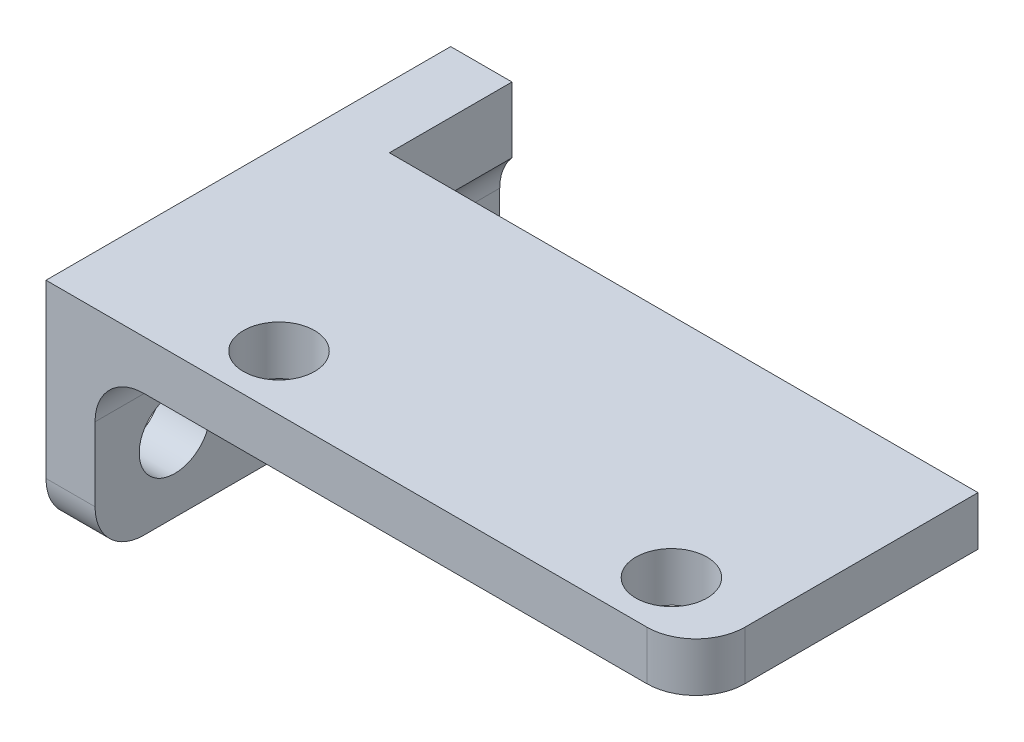
ISO-10303-21;
HEADER;
FILE_DESCRIPTION(('STEP AP214'),'2;1');
FILE_NAME('part.step','',(''),(''),'','','');
FILE_SCHEMA(('AUTOMOTIVE_DESIGN { 1 0 10303 214 1 1 1 1 }'));
ENDSEC;
DATA;
#1=APPLICATION_CONTEXT('core data for automotive mechanical design processes');
#2=APPLICATION_PROTOCOL_DEFINITION('international standard','automotive_design',2000,#1);
#3=PRODUCT_CONTEXT('',#1,'mechanical');
#4=PRODUCT('Part','Part','',(#3));
#5=PRODUCT_RELATED_PRODUCT_CATEGORY('part','',(#4));
#6=PRODUCT_DEFINITION_FORMATION('','',#4);
#7=PRODUCT_DEFINITION_CONTEXT('part definition',#1,'design');
#8=PRODUCT_DEFINITION('design','',#6,#7);
#9=PRODUCT_DEFINITION_SHAPE('','',#8);
#10=(LENGTH_UNIT() NAMED_UNIT(*) SI_UNIT(.MILLI.,.METRE.));
#11=(NAMED_UNIT(*) PLANE_ANGLE_UNIT() SI_UNIT($,.RADIAN.));
#12=(NAMED_UNIT(*) SI_UNIT($,.STERADIAN.) SOLID_ANGLE_UNIT());
#13=UNCERTAINTY_MEASURE_WITH_UNIT(LENGTH_MEASURE(1.E-05),#10,'distance_accuracy_value','');
#14=(GEOMETRIC_REPRESENTATION_CONTEXT(3) GLOBAL_UNCERTAINTY_ASSIGNED_CONTEXT((#13)) GLOBAL_UNIT_ASSIGNED_CONTEXT((#10,
#11,#12)) REPRESENTATION_CONTEXT('',''));
#15=CARTESIAN_POINT('',(0.,0.,0.));
#16=DIRECTION('',(0.,0.,1.));
#17=DIRECTION('',(1.,0.,0.));
#18=AXIS2_PLACEMENT_3D('',#15,#16,#17);
#19=CARTESIAN_POINT('',(0.,2.,0.));
#20=DIRECTION('',(0.,-1.,0.));
#21=DIRECTION('',(0.,0.,-1.));
#22=AXIS2_PLACEMENT_3D('',#19,#20,#21);
#23=PLANE('',#22);
#24=DIRECTION('',(1.,0.,0.));
#25=VECTOR('',#24,1.);
#26=CARTESIAN_POINT('',(-12.75,2.,-3.25000000000001));
#27=LINE('',#26,#25);
#28=CARTESIAN_POINT('',(-12.75,2.,-3.25000000000001));
#29=VERTEX_POINT('',#28);
#30=CARTESIAN_POINT('',(11.25,2.,-3.25000000000001));
#31=VERTEX_POINT('',#30);
#32=EDGE_CURVE('E132',#29,#31,#27,.T.);
#33=ORIENTED_EDGE('',*,*,#32,.F.);
#34=DIRECTION('',(0.,0.,1.));
#35=VECTOR('',#34,1.);
#36=CARTESIAN_POINT('',(-12.75,2.,-8.25000000000001));
#37=LINE('',#36,#35);
#38=CARTESIAN_POINT('',(-12.75,2.,-8.25000000000001));
#39=VERTEX_POINT('',#38);
#40=EDGE_CURVE('E138',#39,#29,#37,.T.);
#41=ORIENTED_EDGE('',*,*,#40,.F.);
#42=DIRECTION('',(-1.,0.,0.));
#43=VECTOR('',#42,1.);
#44=CARTESIAN_POINT('',(-11.25,2.,-8.25000000000002));
#45=LINE('',#44,#43);
#46=CARTESIAN_POINT('',(-15.25,2.,-8.25000000000001));
#47=VERTEX_POINT('',#46);
#48=EDGE_CURVE('E196',#39,#47,#45,.T.);
#49=ORIENTED_EDGE('',*,*,#48,.T.);
#50=DIRECTION('',(0.,0.,-1.));
#51=VECTOR('',#50,1.);
#52=CARTESIAN_POINT('',(-15.25,2.,-8.25000000000001));
#53=LINE('',#52,#51);
#54=CARTESIAN_POINT('',(-15.25,2.,8.24999999999999));
#55=VERTEX_POINT('',#54);
#56=EDGE_CURVE('E173',#55,#47,#53,.T.);
#57=ORIENTED_EDGE('',*,*,#56,.F.);
#58=DIRECTION('',(1.,0.,0.));
#59=VECTOR('',#58,1.);
#60=CARTESIAN_POINT('',(-13.25,2.,8.24999999999998));
#61=LINE('',#60,#59);
#62=CARTESIAN_POINT('',(9.24999999999998,2.,8.25));
#63=VERTEX_POINT('',#62);
#64=EDGE_CURVE('E199',#55,#63,#61,.T.);
#65=ORIENTED_EDGE('',*,*,#64,.T.);
#66=CARTESIAN_POINT('',(9.24999999999999,2.,6.24999999999999));
#67=DIRECTION('',(0.,-1.,0.));
#68=DIRECTION('',(0.,0.,-1.));
#69=AXIS2_PLACEMENT_3D('',#66,#67,#68);
#70=CIRCLE('',#69,2.);
#71=CARTESIAN_POINT('',(11.25,2.,6.25));
#72=VERTEX_POINT('',#71);
#73=EDGE_CURVE('E62',#63,#72,#70,.F.);
#74=ORIENTED_EDGE('',*,*,#73,.T.);
#75=DIRECTION('',(0.,0.,-1.));
#76=VECTOR('',#75,1.);
#77=CARTESIAN_POINT('',(11.25,2.,-8.25));
#78=LINE('',#77,#76);
#79=EDGE_CURVE('E145',#72,#31,#78,.T.);
#80=ORIENTED_EDGE('',*,*,#79,.T.);
#81=EDGE_LOOP('',(#33,#41,#49,#57,#65,#74,#80));
#82=FACE_BOUND('',#81,.T.);
#83=CARTESIAN_POINT('',(-8.,2.,5.99999999999998));
#84=DIRECTION('',(0.,1.,0.));
#85=DIRECTION('',(0.,0.,1.));
#86=AXIS2_PLACEMENT_3D('',#83,#84,#85);
#87=CIRCLE('',#86,1.45);
#88=CARTESIAN_POINT('',(-8.,2.,7.44999999999998));
#89=VERTEX_POINT('',#88);
#90=EDGE_CURVE('E189',#89,#89,#87,.T.);
#91=ORIENTED_EDGE('',*,*,#90,.F.);
#92=EDGE_LOOP('',(#91));
#93=FACE_BOUND('',#92,.T.);
#94=CARTESIAN_POINT('',(8.,2.,5.99999999999998));
#95=DIRECTION('',(0.,1.,0.));
#96=DIRECTION('',(0.,0.,-1.));
#97=AXIS2_PLACEMENT_3D('',#94,#95,#96);
#98=CIRCLE('',#97,1.45);
#99=CARTESIAN_POINT('',(8.,2.,4.54999999999998));
#100=VERTEX_POINT('',#99);
#101=EDGE_CURVE('E183',#100,#100,#98,.T.);
#102=ORIENTED_EDGE('',*,*,#101,.F.);
#103=EDGE_LOOP('',(#102));
#104=FACE_BOUND('',#103,.T.);
#105=ADVANCED_FACE('F39',(#82,#93,#104),#23,.F.);
#106=CARTESIAN_POINT('',(0.,0.,0.));
#107=DIRECTION('',(0.,-1.,0.));
#108=DIRECTION('',(0.,0.,-1.));
#109=AXIS2_PLACEMENT_3D('',#106,#107,#108);
#110=PLANE('',#109);
#111=DIRECTION('',(-1.,0.,0.));
#112=VECTOR('',#111,1.);
#113=CARTESIAN_POINT('',(0.,0.,-3.25000000000001));
#114=LINE('',#113,#112);
#115=CARTESIAN_POINT('',(11.25,0.,-3.25000000000001));
#116=VERTEX_POINT('',#115);
#117=CARTESIAN_POINT('',(-11.25,0.,-3.25000000000001));
#118=VERTEX_POINT('',#117);
#119=EDGE_CURVE('E54',#116,#118,#114,.T.);
#120=ORIENTED_EDGE('',*,*,#119,.F.);
#121=DIRECTION('',(0.,0.,-1.));
#122=VECTOR('',#121,1.);
#123=CARTESIAN_POINT('',(11.25,0.,-8.25));
#124=LINE('',#123,#122);
#125=CARTESIAN_POINT('',(11.25,0.,6.25));
#126=VERTEX_POINT('',#125);
#127=EDGE_CURVE('E192',#126,#116,#124,.T.);
#128=ORIENTED_EDGE('',*,*,#127,.F.);
#129=CARTESIAN_POINT('',(9.24999999999999,0.,6.24999999999999));
#130=DIRECTION('',(0.,-1.,0.));
#131=DIRECTION('',(0.,0.,-1.));
#132=AXIS2_PLACEMENT_3D('',#129,#130,#131);
#133=CIRCLE('',#132,2.);
#134=CARTESIAN_POINT('',(9.24999999999998,0.,8.24999999999999));
#135=VERTEX_POINT('',#134);
#136=EDGE_CURVE('E235',#126,#135,#133,.T.);
#137=ORIENTED_EDGE('',*,*,#136,.T.);
#138=DIRECTION('',(1.,0.,0.));
#139=VECTOR('',#138,1.);
#140=CARTESIAN_POINT('',(11.25,0.,8.24999999999999));
#141=LINE('',#140,#139);
#142=CARTESIAN_POINT('',(-11.25,0.,8.24999999999998));
#143=VERTEX_POINT('',#142);
#144=EDGE_CURVE('E197',#143,#135,#141,.T.);
#145=ORIENTED_EDGE('',*,*,#144,.F.);
#146=DIRECTION('',(0.,0.,1.));
#147=VECTOR('',#146,1.);
#148=CARTESIAN_POINT('',(-11.25,0.,0.));
#149=LINE('',#148,#147);
#150=EDGE_CURVE('E208',#143,#118,#149,.F.);
#151=ORIENTED_EDGE('',*,*,#150,.T.);
#152=EDGE_LOOP('',(#120,#128,#137,#145,#151));
#153=FACE_BOUND('',#152,.T.);
#154=CARTESIAN_POINT('',(-8.,0.,5.99999999999998));
#155=DIRECTION('',(0.,1.,0.));
#156=DIRECTION('',(0.,0.,1.));
#157=AXIS2_PLACEMENT_3D('',#154,#155,#156);
#158=CIRCLE('',#157,1.45);
#159=CARTESIAN_POINT('',(-8.,0.,7.44999999999998));
#160=VERTEX_POINT('',#159);
#161=EDGE_CURVE('E186',#160,#160,#158,.T.);
#162=ORIENTED_EDGE('',*,*,#161,.T.);
#163=EDGE_LOOP('',(#162));
#164=FACE_BOUND('',#163,.T.);
#165=CARTESIAN_POINT('',(8.,0.,5.99999999999998));
#166=DIRECTION('',(0.,1.,0.));
#167=DIRECTION('',(0.,0.,-1.));
#168=AXIS2_PLACEMENT_3D('',#165,#166,#167);
#169=CIRCLE('',#168,1.45);
#170=CARTESIAN_POINT('',(8.,0.,4.54999999999998));
#171=VERTEX_POINT('',#170);
#172=EDGE_CURVE('E176',#171,#171,#169,.T.);
#173=ORIENTED_EDGE('',*,*,#172,.T.);
#174=EDGE_LOOP('',(#173));
#175=FACE_BOUND('',#174,.T.);
#176=ADVANCED_FACE('F247',(#153,#164,#175),#110,.T.);
#177=CARTESIAN_POINT('',(11.25,2.,-8.25));
#178=DIRECTION('',(-1.,0.,0.));
#179=DIRECTION('',(0.,0.,1.));
#180=AXIS2_PLACEMENT_3D('',#177,#178,#179);
#181=PLANE('',#180);
#182=ORIENTED_EDGE('',*,*,#127,.T.);
#183=DIRECTION('',(0.,1.,0.));
#184=VECTOR('',#183,1.);
#185=CARTESIAN_POINT('',(11.25,-7.,-3.25000000000001));
#186=LINE('',#185,#184);
#187=EDGE_CURVE('E135',#116,#31,#186,.T.);
#188=ORIENTED_EDGE('',*,*,#187,.T.);
#189=ORIENTED_EDGE('',*,*,#79,.F.);
#190=DIRECTION('',(0.,-1.,0.));
#191=VECTOR('',#190,1.);
#192=CARTESIAN_POINT('',(11.25,2.,6.25));
#193=LINE('',#192,#191);
#194=EDGE_CURVE('E237',#72,#126,#193,.T.);
#195=ORIENTED_EDGE('',*,*,#194,.T.);
#196=EDGE_LOOP('',(#182,#188,#189,#195));
#197=FACE_BOUND('',#196,.T.);
#198=ADVANCED_FACE('F258',(#197),#181,.F.);
#199=CARTESIAN_POINT('',(-11.25,2.,-8.25000000000002));
#200=DIRECTION('',(0.,0.,1.));
#201=DIRECTION('',(1.,0.,0.));
#202=AXIS2_PLACEMENT_3D('',#199,#200,#201);
#203=PLANE('',#202);
#204=ORIENTED_EDGE('',*,*,#48,.F.);
#205=DIRECTION('',(0.,1.,0.));
#206=VECTOR('',#205,1.);
#207=CARTESIAN_POINT('',(-12.75,-7.,-8.25000000000001));
#208=LINE('',#207,#206);
#209=CARTESIAN_POINT('',(-12.75,-0.6771243444677,-8.25000000000001));
#210=VERTEX_POINT('',#209);
#211=EDGE_CURVE('E141',#210,#39,#208,.T.);
#212=ORIENTED_EDGE('',*,*,#211,.F.);
#213=CARTESIAN_POINT('',(-11.25,-2.,-8.25000000000002));
#214=DIRECTION('',(0.,0.,1.));
#215=DIRECTION('',(1.,0.,0.));
#216=AXIS2_PLACEMENT_3D('',#213,#214,#215);
#217=CIRCLE('',#216,2.);
#218=CARTESIAN_POINT('',(-13.25,-2.,-8.25000000000001));
#219=VERTEX_POINT('',#218);
#220=EDGE_CURVE('E213',#210,#219,#217,.T.);
#221=ORIENTED_EDGE('',*,*,#220,.T.);
#222=DIRECTION('',(0.,-1.,0.));
#223=VECTOR('',#222,1.);
#224=CARTESIAN_POINT('',(-13.25,2.,-8.25000000000001));
#225=LINE('',#224,#223);
#226=CARTESIAN_POINT('',(-13.25,-5.,-8.25000000000001));
#227=VERTEX_POINT('',#226);
#228=EDGE_CURVE('E161',#219,#227,#225,.T.);
#229=ORIENTED_EDGE('',*,*,#228,.T.);
#230=DIRECTION('',(1.,0.,0.));
#231=VECTOR('',#230,1.);
#232=CARTESIAN_POINT('',(-11.25,-5.,-8.25000000000002));
#233=LINE('',#232,#231);
#234=CARTESIAN_POINT('',(-15.25,-5.,-8.25000000000001));
#235=VERTEX_POINT('',#234);
#236=EDGE_CURVE('E233',#227,#235,#233,.F.);
#237=ORIENTED_EDGE('',*,*,#236,.T.);
#238=DIRECTION('',(0.,-1.,0.));
#239=VECTOR('',#238,1.);
#240=CARTESIAN_POINT('',(-15.25,2.,-8.25000000000001));
#241=LINE('',#240,#239);
#242=EDGE_CURVE('E164',#47,#235,#241,.T.);
#243=ORIENTED_EDGE('',*,*,#242,.F.);
#244=EDGE_LOOP('',(#204,#212,#221,#229,#237,#243));
#245=FACE_BOUND('',#244,.T.);
#246=ADVANCED_FACE('F260',(#245),#203,.F.);
#247=CARTESIAN_POINT('',(11.25,2.,8.24999999999999));
#248=DIRECTION('',(0.,0.,-1.));
#249=DIRECTION('',(-1.,0.,0.));
#250=AXIS2_PLACEMENT_3D('',#247,#248,#249);
#251=PLANE('',#250);
#252=DIRECTION('',(0.,1.,0.));
#253=VECTOR('',#252,1.);
#254=CARTESIAN_POINT('',(-15.25,2.,8.24999999999999));
#255=LINE('',#254,#253);
#256=CARTESIAN_POINT('',(-15.25,-5.,8.24999999999999));
#257=VERTEX_POINT('',#256);
#258=EDGE_CURVE('E171',#257,#55,#255,.T.);
#259=ORIENTED_EDGE('',*,*,#258,.F.);
#260=DIRECTION('',(1.,0.,0.));
#261=VECTOR('',#260,1.);
#262=CARTESIAN_POINT('',(11.25,-5.,8.24999999999999));
#263=LINE('',#262,#261);
#264=CARTESIAN_POINT('',(-13.25,-5.,8.24999999999999));
#265=VERTEX_POINT('',#264);
#266=EDGE_CURVE('E217',#257,#265,#263,.T.);
#267=ORIENTED_EDGE('',*,*,#266,.T.);
#268=DIRECTION('',(0.,1.,0.));
#269=VECTOR('',#268,1.);
#270=CARTESIAN_POINT('',(-13.25,2.,8.24999999999999));
#271=LINE('',#270,#269);
#272=CARTESIAN_POINT('',(-13.25,-2.,8.24999999999999));
#273=VERTEX_POINT('',#272);
#274=EDGE_CURVE('E168',#265,#273,#271,.T.);
#275=ORIENTED_EDGE('',*,*,#274,.T.);
#276=CARTESIAN_POINT('',(-11.25,-2.,8.24999999999998));
#277=DIRECTION('',(0.,0.,-1.));
#278=DIRECTION('',(-1.,0.,0.));
#279=AXIS2_PLACEMENT_3D('',#276,#277,#278);
#280=CIRCLE('',#279,2.);
#281=EDGE_CURVE('E211',#273,#143,#280,.T.);
#282=ORIENTED_EDGE('',*,*,#281,.T.);
#283=ORIENTED_EDGE('',*,*,#144,.T.);
#284=DIRECTION('',(0.,-1.,0.));
#285=VECTOR('',#284,1.);
#286=CARTESIAN_POINT('',(9.24999999999998,2.,8.24999999999999));
#287=LINE('',#286,#285);
#288=EDGE_CURVE('E215',#135,#63,#287,.F.);
#289=ORIENTED_EDGE('',*,*,#288,.T.);
#290=ORIENTED_EDGE('',*,*,#64,.F.);
#291=EDGE_LOOP('',(#259,#267,#275,#282,#283,#289,#290));
#292=FACE_BOUND('',#291,.T.);
#293=ADVANCED_FACE('F253',(#292),#251,.F.);
#294=CARTESIAN_POINT('',(-8.,2.,5.99999999999998));
#295=DIRECTION('',(0.,-1.,0.));
#296=DIRECTION('',(0.,0.,-1.));
#297=AXIS2_PLACEMENT_3D('',#294,#295,#296);
#298=CYLINDRICAL_SURFACE('',#297,1.45);
#299=ORIENTED_EDGE('',*,*,#90,.T.);
#300=EDGE_LOOP('',(#299));
#301=FACE_BOUND('',#300,.T.);
#302=ORIENTED_EDGE('',*,*,#161,.F.);
#303=EDGE_LOOP('',(#302));
#304=FACE_BOUND('',#303,.T.);
#305=ADVANCED_FACE('F276',(#301,#304),#298,.F.);
#306=CARTESIAN_POINT('',(8.,2.,5.99999999999998));
#307=DIRECTION('',(0.,-1.,0.));
#308=DIRECTION('',(0.,0.,-1.));
#309=AXIS2_PLACEMENT_3D('',#306,#307,#308);
#310=CYLINDRICAL_SURFACE('',#309,1.45);
#311=ORIENTED_EDGE('',*,*,#101,.T.);
#312=EDGE_LOOP('',(#311));
#313=FACE_BOUND('',#312,.T.);
#314=ORIENTED_EDGE('',*,*,#172,.F.);
#315=EDGE_LOOP('',(#314));
#316=FACE_BOUND('',#315,.T.);
#317=ADVANCED_FACE('F285',(#313,#316),#310,.F.);
#318=CARTESIAN_POINT('',(-13.25,0.,0.));
#319=DIRECTION('',(-1.,0.,0.));
#320=DIRECTION('',(0.,0.,1.));
#321=AXIS2_PLACEMENT_3D('',#318,#319,#320);
#322=PLANE('',#321);
#323=CARTESIAN_POINT('',(-13.25,-4.,-5.));
#324=DIRECTION('',(-1.,0.,0.));
#325=DIRECTION('',(0.,0.,1.));
#326=AXIS2_PLACEMENT_3D('',#323,#324,#325);
#327=CIRCLE('',#326,1.45);
#328=CARTESIAN_POINT('',(-13.25,-4.,-3.55));
#329=VERTEX_POINT('',#328);
#330=EDGE_CURVE('E155',#329,#329,#327,.T.);
#331=ORIENTED_EDGE('',*,*,#330,.T.);
#332=EDGE_LOOP('',(#331));
#333=FACE_BOUND('',#332,.T.);
#334=CARTESIAN_POINT('',(-13.25,-4.,5.));
#335=DIRECTION('',(-1.,0.,0.));
#336=DIRECTION('',(0.,0.,-1.));
#337=AXIS2_PLACEMENT_3D('',#334,#335,#336);
#338=CIRCLE('',#337,1.45);
#339=CARTESIAN_POINT('',(-13.25,-4.,3.55));
#340=VERTEX_POINT('',#339);
#341=EDGE_CURVE('E151',#340,#340,#338,.T.);
#342=ORIENTED_EDGE('',*,*,#341,.T.);
#343=EDGE_LOOP('',(#342));
#344=FACE_BOUND('',#343,.T.);
#345=ORIENTED_EDGE('',*,*,#274,.F.);
#346=CARTESIAN_POINT('',(-13.25,-5.,6.24999999999998));
#347=DIRECTION('',(-1.,0.,0.));
#348=DIRECTION('',(0.,0.,1.));
#349=AXIS2_PLACEMENT_3D('',#346,#347,#348);
#350=CIRCLE('',#349,2.);
#351=CARTESIAN_POINT('',(-13.25,-7.,6.24999999999998));
#352=VERTEX_POINT('',#351);
#353=EDGE_CURVE('E222',#265,#352,#350,.F.);
#354=ORIENTED_EDGE('',*,*,#353,.T.);
#355=DIRECTION('',(0.,0.,1.));
#356=VECTOR('',#355,1.);
#357=CARTESIAN_POINT('',(-13.25,-7.,-8.25000000000001));
#358=LINE('',#357,#356);
#359=CARTESIAN_POINT('',(-13.25,-7.,-6.25000000000002));
#360=VERTEX_POINT('',#359);
#361=EDGE_CURVE('E179',#360,#352,#358,.T.);
#362=ORIENTED_EDGE('',*,*,#361,.F.);
#363=CARTESIAN_POINT('',(-13.25,-5.,-6.25000000000002));
#364=DIRECTION('',(-1.,0.,0.));
#365=DIRECTION('',(0.,0.,1.));
#366=AXIS2_PLACEMENT_3D('',#363,#364,#365);
#367=CIRCLE('',#366,2.);
#368=EDGE_CURVE('E220',#360,#227,#367,.F.);
#369=ORIENTED_EDGE('',*,*,#368,.T.);
#370=ORIENTED_EDGE('',*,*,#228,.F.);
#371=DIRECTION('',(0.,0.,1.));
#372=VECTOR('',#371,1.);
#373=CARTESIAN_POINT('',(-13.25,-2.,0.));
#374=LINE('',#373,#372);
#375=EDGE_CURVE('E201',#219,#273,#374,.T.);
#376=ORIENTED_EDGE('',*,*,#375,.T.);
#377=EDGE_LOOP('',(#345,#354,#362,#369,#370,#376));
#378=FACE_BOUND('',#377,.T.);
#379=ADVANCED_FACE('F290',(#333,#344,#378),#322,.F.);
#380=CARTESIAN_POINT('',(-15.25,0.,0.));
#381=DIRECTION('',(-1.,0.,0.));
#382=DIRECTION('',(0.,0.,1.));
#383=AXIS2_PLACEMENT_3D('',#380,#381,#382);
#384=PLANE('',#383);
#385=CARTESIAN_POINT('',(-15.25,-4.,-5.));
#386=DIRECTION('',(-1.,0.,0.));
#387=DIRECTION('',(0.,0.,1.));
#388=AXIS2_PLACEMENT_3D('',#385,#386,#387);
#389=CIRCLE('',#388,1.45);
#390=CARTESIAN_POINT('',(-15.25,-4.,-3.55));
#391=VERTEX_POINT('',#390);
#392=EDGE_CURVE('E158',#391,#391,#389,.T.);
#393=ORIENTED_EDGE('',*,*,#392,.F.);
#394=EDGE_LOOP('',(#393));
#395=FACE_BOUND('',#394,.T.);
#396=DIRECTION('',(0.,0.,1.));
#397=VECTOR('',#396,1.);
#398=CARTESIAN_POINT('',(-15.25,-7.,-8.25000000000001));
#399=LINE('',#398,#397);
#400=CARTESIAN_POINT('',(-15.25,-7.,-6.25000000000002));
#401=VERTEX_POINT('',#400);
#402=CARTESIAN_POINT('',(-15.25,-7.,6.24999999999998));
#403=VERTEX_POINT('',#402);
#404=EDGE_CURVE('E167',#401,#403,#399,.T.);
#405=ORIENTED_EDGE('',*,*,#404,.T.);
#406=CARTESIAN_POINT('',(-15.25,-5.,6.24999999999998));
#407=DIRECTION('',(-1.,0.,0.));
#408=DIRECTION('',(0.,0.,1.));
#409=AXIS2_PLACEMENT_3D('',#406,#407,#408);
#410=CIRCLE('',#409,2.);
#411=EDGE_CURVE('E231',#403,#257,#410,.T.);
#412=ORIENTED_EDGE('',*,*,#411,.T.);
#413=ORIENTED_EDGE('',*,*,#258,.T.);
#414=ORIENTED_EDGE('',*,*,#56,.T.);
#415=ORIENTED_EDGE('',*,*,#242,.T.);
#416=CARTESIAN_POINT('',(-15.25,-5.,-6.25000000000002));
#417=DIRECTION('',(-1.,0.,0.));
#418=DIRECTION('',(0.,0.,1.));
#419=AXIS2_PLACEMENT_3D('',#416,#417,#418);
#420=CIRCLE('',#419,2.);
#421=EDGE_CURVE('E229',#235,#401,#420,.T.);
#422=ORIENTED_EDGE('',*,*,#421,.T.);
#423=EDGE_LOOP('',(#405,#412,#413,#414,#415,#422));
#424=FACE_BOUND('',#423,.T.);
#425=CARTESIAN_POINT('',(-15.25,-4.,5.));
#426=DIRECTION('',(-1.,0.,0.));
#427=DIRECTION('',(0.,0.,-1.));
#428=AXIS2_PLACEMENT_3D('',#425,#426,#427);
#429=CIRCLE('',#428,1.45);
#430=CARTESIAN_POINT('',(-15.25,-4.,3.55));
#431=VERTEX_POINT('',#430);
#432=EDGE_CURVE('E152',#431,#431,#429,.T.);
#433=ORIENTED_EDGE('',*,*,#432,.F.);
#434=EDGE_LOOP('',(#433));
#435=FACE_BOUND('',#434,.T.);
#436=ADVANCED_FACE('F303',(#395,#424,#435),#384,.T.);
#437=CARTESIAN_POINT('',(-15.25,-7.,-8.25000000000001));
#438=DIRECTION('',(0.,1.,0.));
#439=DIRECTION('',(0.,0.,1.));
#440=AXIS2_PLACEMENT_3D('',#437,#438,#439);
#441=PLANE('',#440);
#442=ORIENTED_EDGE('',*,*,#361,.T.);
#443=DIRECTION('',(1.,0.,0.));
#444=VECTOR('',#443,1.);
#445=CARTESIAN_POINT('',(-15.25,-7.,6.24999999999998));
#446=LINE('',#445,#444);
#447=EDGE_CURVE('E227',#352,#403,#446,.F.);
#448=ORIENTED_EDGE('',*,*,#447,.T.);
#449=ORIENTED_EDGE('',*,*,#404,.F.);
#450=DIRECTION('',(1.,0.,0.));
#451=VECTOR('',#450,1.);
#452=CARTESIAN_POINT('',(-15.25,-7.,-6.25000000000002));
#453=LINE('',#452,#451);
#454=EDGE_CURVE('E224',#401,#360,#453,.T.);
#455=ORIENTED_EDGE('',*,*,#454,.T.);
#456=EDGE_LOOP('',(#442,#448,#449,#455));
#457=FACE_BOUND('',#456,.T.);
#458=ADVANCED_FACE('F307',(#457),#441,.F.);
#459=CARTESIAN_POINT('',(-15.25,-4.,-5.));
#460=DIRECTION('',(1.,0.,0.));
#461=DIRECTION('',(0.,0.,-1.));
#462=AXIS2_PLACEMENT_3D('',#459,#460,#461);
#463=CYLINDRICAL_SURFACE('',#462,1.45);
#464=ORIENTED_EDGE('',*,*,#392,.T.);
#465=EDGE_LOOP('',(#464));
#466=FACE_BOUND('',#465,.T.);
#467=ORIENTED_EDGE('',*,*,#330,.F.);
#468=EDGE_LOOP('',(#467));
#469=FACE_BOUND('',#468,.T.);
#470=ADVANCED_FACE('F309',(#466,#469),#463,.F.);
#471=CARTESIAN_POINT('',(-15.25,-4.,5.));
#472=DIRECTION('',(1.,0.,0.));
#473=DIRECTION('',(0.,0.,-1.));
#474=AXIS2_PLACEMENT_3D('',#471,#472,#473);
#475=CYLINDRICAL_SURFACE('',#474,1.45);
#476=ORIENTED_EDGE('',*,*,#432,.T.);
#477=EDGE_LOOP('',(#476));
#478=FACE_BOUND('',#477,.T.);
#479=ORIENTED_EDGE('',*,*,#341,.F.);
#480=EDGE_LOOP('',(#479));
#481=FACE_BOUND('',#480,.T.);
#482=ADVANCED_FACE('F316',(#478,#481),#475,.F.);
#483=CARTESIAN_POINT('',(-11.25,-2.,0.));
#484=DIRECTION('',(0.,0.,1.));
#485=DIRECTION('',(1.,0.,0.));
#486=AXIS2_PLACEMENT_3D('',#483,#484,#485);
#487=CYLINDRICAL_SURFACE('',#486,2.);
#488=ORIENTED_EDGE('',*,*,#220,.F.);
#489=DIRECTION('',(0.,0.,1.));
#490=VECTOR('',#489,1.);
#491=CARTESIAN_POINT('',(-12.75,-0.677124344467706,0.));
#492=LINE('',#491,#490);
#493=CARTESIAN_POINT('',(-12.75,-0.677124344467704,-3.25000000000001));
#494=VERTEX_POINT('',#493);
#495=EDGE_CURVE('E11',#210,#494,#492,.T.);
#496=ORIENTED_EDGE('',*,*,#495,.T.);
#497=CARTESIAN_POINT('',(-11.25,-2.,-3.25000000000001));
#498=DIRECTION('',(0.,0.,1.));
#499=DIRECTION('',(1.,0.,0.));
#500=AXIS2_PLACEMENT_3D('',#497,#498,#499);
#501=CIRCLE('',#500,2.);
#502=EDGE_CURVE('E47',#494,#118,#501,.F.);
#503=ORIENTED_EDGE('',*,*,#502,.T.);
#504=ORIENTED_EDGE('',*,*,#150,.F.);
#505=ORIENTED_EDGE('',*,*,#281,.F.);
#506=ORIENTED_EDGE('',*,*,#375,.F.);
#507=EDGE_LOOP('',(#488,#496,#503,#504,#505,#506));
#508=FACE_BOUND('',#507,.T.);
#509=ADVANCED_FACE('F243',(#508),#487,.F.);
#510=CARTESIAN_POINT('',(11.25,-5.,6.25));
#511=DIRECTION('',(1.,0.,0.));
#512=DIRECTION('',(0.,0.,-1.));
#513=AXIS2_PLACEMENT_3D('',#510,#511,#512);
#514=CYLINDRICAL_SURFACE('',#513,2.);
#515=ORIENTED_EDGE('',*,*,#411,.F.);
#516=ORIENTED_EDGE('',*,*,#447,.F.);
#517=ORIENTED_EDGE('',*,*,#353,.F.);
#518=ORIENTED_EDGE('',*,*,#266,.F.);
#519=EDGE_LOOP('',(#515,#516,#517,#518));
#520=FACE_BOUND('',#519,.T.);
#521=ADVANCED_FACE('F337',(#520),#514,.T.);
#522=CARTESIAN_POINT('',(-15.25,-5.,-6.25000000000002));
#523=DIRECTION('',(1.,0.,0.));
#524=DIRECTION('',(0.,0.,-1.));
#525=AXIS2_PLACEMENT_3D('',#522,#523,#524);
#526=CYLINDRICAL_SURFACE('',#525,2.);
#527=ORIENTED_EDGE('',*,*,#421,.F.);
#528=ORIENTED_EDGE('',*,*,#236,.F.);
#529=ORIENTED_EDGE('',*,*,#368,.F.);
#530=ORIENTED_EDGE('',*,*,#454,.F.);
#531=EDGE_LOOP('',(#527,#528,#529,#530));
#532=FACE_BOUND('',#531,.T.);
#533=ADVANCED_FACE('F395',(#532),#526,.T.);
#534=CARTESIAN_POINT('',(9.24999999999999,2.,6.24999999999999));
#535=DIRECTION('',(0.,-1.,0.));
#536=DIRECTION('',(0.,0.,-1.));
#537=AXIS2_PLACEMENT_3D('',#534,#535,#536);
#538=CYLINDRICAL_SURFACE('',#537,2.);
#539=ORIENTED_EDGE('',*,*,#73,.F.);
#540=ORIENTED_EDGE('',*,*,#288,.F.);
#541=ORIENTED_EDGE('',*,*,#136,.F.);
#542=ORIENTED_EDGE('',*,*,#194,.F.);
#543=EDGE_LOOP('',(#539,#540,#541,#542));
#544=FACE_BOUND('',#543,.T.);
#545=ADVANCED_FACE('F41',(#544),#538,.T.);
#546=CARTESIAN_POINT('',(-12.75,-7.,-8.25000000000001));
#547=DIRECTION('',(-1.,0.,0.));
#548=DIRECTION('',(0.,0.,1.));
#549=AXIS2_PLACEMENT_3D('',#546,#547,#548);
#550=PLANE('',#549);
#551=ORIENTED_EDGE('',*,*,#211,.T.);
#552=ORIENTED_EDGE('',*,*,#40,.T.);
#553=DIRECTION('',(0.,1.,0.));
#554=VECTOR('',#553,1.);
#555=CARTESIAN_POINT('',(-12.75,-7.,-3.25000000000001));
#556=LINE('',#555,#554);
#557=EDGE_CURVE('E128',#494,#29,#556,.T.);
#558=ORIENTED_EDGE('',*,*,#557,.F.);
#559=ORIENTED_EDGE('',*,*,#495,.F.);
#560=EDGE_LOOP('',(#551,#552,#558,#559));
#561=FACE_BOUND('',#560,.T.);
#562=ADVANCED_FACE('F139',(#561),#550,.F.);
#563=CARTESIAN_POINT('',(-12.75,-7.,-3.25000000000001));
#564=DIRECTION('',(0.,0.,1.));
#565=DIRECTION('',(1.,0.,0.));
#566=AXIS2_PLACEMENT_3D('',#563,#564,#565);
#567=PLANE('',#566);
#568=ORIENTED_EDGE('',*,*,#119,.T.);
#569=ORIENTED_EDGE('',*,*,#502,.F.);
#570=ORIENTED_EDGE('',*,*,#557,.T.);
#571=ORIENTED_EDGE('',*,*,#32,.T.);
#572=ORIENTED_EDGE('',*,*,#187,.F.);
#573=EDGE_LOOP('',(#568,#569,#570,#571,#572));
#574=FACE_BOUND('',#573,.T.);
#575=ADVANCED_FACE('F130',(#574),#567,.F.);
#576=CLOSED_SHELL('',(#105,#176,#198,#246,#293,#305,#317,#379,#436,#458,#470,#482,#509,#521,
#533,#545,#562,#575));
#577=MANIFOLD_SOLID_BREP('B2',#576);
#578=ADVANCED_BREP_SHAPE_REPRESENTATION('',(#18,#577),#14);
#579=SHAPE_DEFINITION_REPRESENTATION(#9,#578);
ENDSEC;
END-ISO-10303-21;
